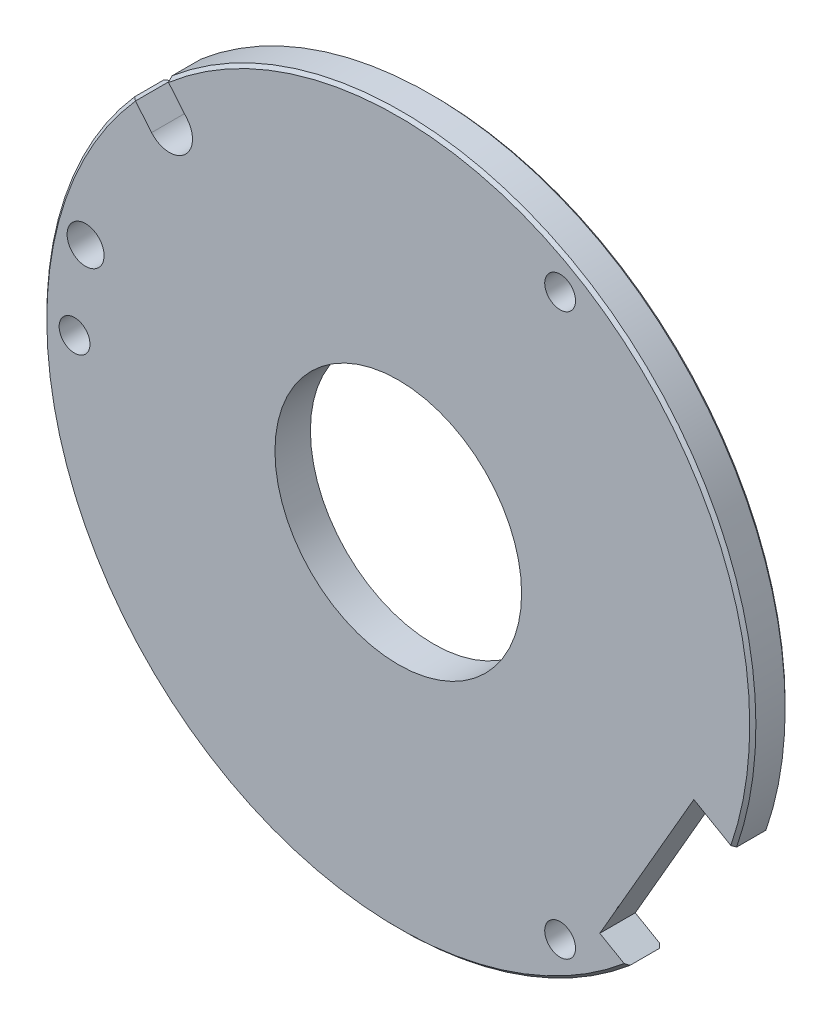
ISO-10303-21;
HEADER;
FILE_DESCRIPTION(('STEP AP214'),'2;1');
FILE_NAME('part.step','',(''),(''),'','','');
FILE_SCHEMA(('AUTOMOTIVE_DESIGN { 1 0 10303 214 1 1 1 1 }'));
ENDSEC;
DATA;
#1=APPLICATION_CONTEXT('core data for automotive mechanical design processes');
#2=APPLICATION_PROTOCOL_DEFINITION('international standard','automotive_design',2000,#1);
#3=PRODUCT_CONTEXT('',#1,'mechanical');
#4=PRODUCT('Part','Part','',(#3));
#5=PRODUCT_RELATED_PRODUCT_CATEGORY('part','',(#4));
#6=PRODUCT_DEFINITION_FORMATION('','',#4);
#7=PRODUCT_DEFINITION_CONTEXT('part definition',#1,'design');
#8=PRODUCT_DEFINITION('design','',#6,#7);
#9=PRODUCT_DEFINITION_SHAPE('','',#8);
#10=(LENGTH_UNIT() NAMED_UNIT(*) SI_UNIT(.MILLI.,.METRE.));
#11=(NAMED_UNIT(*) PLANE_ANGLE_UNIT() SI_UNIT($,.RADIAN.));
#12=(NAMED_UNIT(*) SI_UNIT($,.STERADIAN.) SOLID_ANGLE_UNIT());
#13=UNCERTAINTY_MEASURE_WITH_UNIT(LENGTH_MEASURE(1.E-05),#10,'distance_accuracy_value','');
#14=(GEOMETRIC_REPRESENTATION_CONTEXT(3) GLOBAL_UNCERTAINTY_ASSIGNED_CONTEXT((#13)) GLOBAL_UNIT_ASSIGNED_CONTEXT((#10,
#11,#12)) REPRESENTATION_CONTEXT('',''));
#15=CARTESIAN_POINT('',(0.,0.,0.));
#16=DIRECTION('',(0.,0.,1.));
#17=DIRECTION('',(1.,0.,0.));
#18=AXIS2_PLACEMENT_3D('',#15,#16,#17);
#19=CARTESIAN_POINT('',(0.,0.,10.4999999999999));
#20=DIRECTION('',(0.,0.,-1.));
#21=DIRECTION('',(-1.,0.,0.));
#22=AXIS2_PLACEMENT_3D('',#19,#20,#21);
#23=CONICAL_SURFACE('',#22,115.,0.785398163397457);
#24=CARTESIAN_POINT('',(-74.5095015168763,86.2806938427681,11.4998949724919));
#25=CARTESIAN_POINT('',(-74.489513181679,86.5174766303075,11.3337463305336));
#26=CARTESIAN_POINT('',(-74.4695396318063,86.7540842701747,11.1673474281076));
#27=CARTESIAN_POINT('',(-74.4296221029041,87.2269492522676,10.8340491039387));
#28=CARTESIAN_POINT('',(-74.4096781238743,87.4632065944968,10.6671496822008));
#29=CARTESIAN_POINT('',(-74.3897489301689,87.6992887890571,10.5));
#30=B_SPLINE_CURVE_WITH_KNOTS('',3,(#24,#25,#26,#27,#28,#29),.UNSPECIFIED.,.F.,.F.,(4,2,4),(0.,
0.869848500602146,1.73969699275379),.UNSPECIFIED.);
#31=CARTESIAN_POINT('',(-74.509444984043,86.2807076594142,11.4999214647664));
#32=VERTEX_POINT('',#31);
#33=CARTESIAN_POINT('',(-74.3897489301689,87.6992887890571,10.5));
#34=VERTEX_POINT('',#33);
#35=EDGE_CURVE('E134',#32,#34,#30,.T.);
#36=ORIENTED_EDGE('',*,*,#35,.F.);
#37=CARTESIAN_POINT('',(0.,0.,11.5));
#38=DIRECTION('',(0.,0.,-1.));
#39=DIRECTION('',(-1.,0.,0.));
#40=AXIS2_PLACEMENT_3D('',#37,#38,#39);
#41=CIRCLE('',#40,114.);
#42=CARTESIAN_POINT('',(107.871048306499,-36.8759669331806,11.4999999999999));
#43=VERTEX_POINT('',#42);
#44=EDGE_CURVE('E132',#32,#43,#41,.T.);
#45=ORIENTED_EDGE('',*,*,#44,.T.);
#46=CARTESIAN_POINT('',(107.871048306499,-36.8759669331806,11.4999999999999));
#47=CARTESIAN_POINT('',(108.018138427492,-36.9608894541314,11.3333475453197));
#48=CARTESIAN_POINT('',(108.16522250918,-37.0458084882875,11.1666879846456));
#49=CARTESIAN_POINT('',(108.459378593943,-37.215639583009,10.8333546513123));
#50=CARTESIAN_POINT('',(108.606450597018,-37.3005516435744,10.6666808786531));
#51=CARTESIAN_POINT('',(108.753516560787,-37.3854602173451,10.4999999999999));
#52=B_SPLINE_CURVE_WITH_KNOTS('',3,(#46,#47,#48,#49,#50,#51),.UNSPECIFIED.,.F.,.F.,(4,2,4),(0.,
0.713851110182392,1.42770222035386),.UNSPECIFIED.);
#53=CARTESIAN_POINT('',(108.753516560787,-37.3854602173452,10.5));
#54=VERTEX_POINT('',#53);
#55=EDGE_CURVE('E20',#43,#54,#52,.T.);
#56=ORIENTED_EDGE('',*,*,#55,.T.);
#57=CARTESIAN_POINT('',(0.,0.,10.5));
#58=DIRECTION('',(0.,0.,1.));
#59=DIRECTION('',(1.,0.,0.));
#60=AXIS2_PLACEMENT_3D('',#57,#58,#59);
#61=CIRCLE('',#60,115.);
#62=EDGE_CURVE('E160',#34,#54,#61,.F.);
#63=ORIENTED_EDGE('',*,*,#62,.F.);
#64=EDGE_LOOP('',(#36,#45,#56,#63));
#65=FACE_BOUND('',#64,.T.);
#66=ADVANCED_FACE('F16',(#65),#23,.T.);
#67=CARTESIAN_POINT('',(0.,0.,10.5));
#68=DIRECTION('',(0.,0.,-1.));
#69=DIRECTION('',(-1.,0.,0.));
#70=AXIS2_PLACEMENT_3D('',#67,#68,#69);
#71=CONICAL_SURFACE('',#70,115.,0.785398163397443);
#72=CARTESIAN_POINT('',(-86.5368112390781,75.7388955594955,10.5));
#73=CARTESIAN_POINT('',(-86.3200858516723,75.7357724950764,10.6651442506526));
#74=CARTESIAN_POINT('',(-86.1032347550848,75.7326476191581,10.8301229706168));
#75=CARTESIAN_POINT('',(-85.669281142456,75.7263942443073,11.1597493499963));
#76=CARTESIAN_POINT('',(-85.4521786264135,75.7232657453748,11.3243970094101));
#77=CARTESIAN_POINT('',(-85.234950401188,75.720135434943,11.4888791381337));
#78=B_SPLINE_CURVE_WITH_KNOTS('',3,(#72,#73,#74,#75,#76,#77),.UNSPECIFIED.,.F.,.F.,(4,2,4),(0.,
0.817477381237826,1.6349547665837),.UNSPECIFIED.);
#79=CARTESIAN_POINT('',(-86.5368112390781,75.7388955594955,10.5));
#80=VERTEX_POINT('',#79);
#81=CARTESIAN_POINT('',(-85.2349503365506,75.7201353165115,11.4888792651126));
#82=VERTEX_POINT('',#81);
#83=EDGE_CURVE('E232',#80,#82,#78,.T.);
#84=ORIENTED_EDGE('',*,*,#83,.F.);
#85=CARTESIAN_POINT('',(0.,0.,10.5));
#86=DIRECTION('',(0.,0.,1.));
#87=DIRECTION('',(1.,0.,0.));
#88=AXIS2_PLACEMENT_3D('',#85,#86,#87);
#89=CIRCLE('',#88,115.);
#90=CARTESIAN_POINT('',(74.1909814229737,-87.8675040927872,10.5));
#91=VERTEX_POINT('',#90);
#92=EDGE_CURVE('E165',#91,#80,#89,.F.);
#93=ORIENTED_EDGE('',*,*,#92,.F.);
#94=CARTESIAN_POINT('',(74.1909814229737,-87.8675040927872,10.5));
#95=CARTESIAN_POINT('',(74.0375052317576,-87.7788945724744,10.6667173681921));
#96=CARTESIAN_POINT('',(73.8840083989417,-87.6902731347284,10.833409385614));
#97=CARTESIAN_POINT('',(73.5769734500829,-87.5130064243542,11.1667427189473));
#98=CARTESIAN_POINT('',(73.4234353340401,-87.4243611517259,11.3333840348587));
#99=CARTESIAN_POINT('',(73.2698765763974,-87.3357039616645,11.5));
#100=B_SPLINE_CURVE_WITH_KNOTS('',3,(#94,#95,#96,#97,#98,#99),.UNSPECIFIED.,.F.,.F.,(4,2,4),(0.,
0.729939305876748,1.45987861188388),.UNSPECIFIED.);
#101=CARTESIAN_POINT('',(73.2698765763974,-87.3357039616645,11.5));
#102=VERTEX_POINT('',#101);
#103=EDGE_CURVE('E130',#91,#102,#100,.T.);
#104=ORIENTED_EDGE('',*,*,#103,.T.);
#105=CARTESIAN_POINT('',(0.,0.,11.5));
#106=DIRECTION('',(0.,0.,-1.));
#107=DIRECTION('',(-1.,0.,0.));
#108=AXIS2_PLACEMENT_3D('',#105,#106,#107);
#109=CIRCLE('',#108,114.);
#110=CARTESIAN_POINT('',(-85.227752159781,75.7114935910721,11.5));
#111=VERTEX_POINT('',#110);
#112=EDGE_CURVE('E212',#102,#111,#109,.T.);
#113=ORIENTED_EDGE('',*,*,#112,.T.);
#114=CARTESIAN_POINT('',(-85.227752159781,75.7114935910721,11.5));
#115=CARTESIAN_POINT('',(-85.2280520943159,75.7118536632038,11.4995366285518));
#116=CARTESIAN_POINT('',(-85.2283520282152,75.712213735906,11.4990732571354));
#117=CARTESIAN_POINT('',(-85.2289518947835,75.712933882501,11.4981465143027));
#118=CARTESIAN_POINT('',(-85.2292518274527,75.7132939563938,11.4976831428863));
#119=CARTESIAN_POINT('',(-85.2298516915608,75.7140141053701,11.4967564000536));
#120=CARTESIAN_POINT('',(-85.2301516229997,75.7143741804535,11.4962930286373));
#121=CARTESIAN_POINT('',(-85.2307514846475,75.7150943318109,11.4953662858046));
#122=CARTESIAN_POINT('',(-85.2310514148564,75.7154544080849,11.4949029143882));
#123=CARTESIAN_POINT('',(-85.2316512740439,75.7161745618235,11.4939761715555));
#124=CARTESIAN_POINT('',(-85.2319512030226,75.7165346392881,11.4935128001392));
#125=CARTESIAN_POINT('',(-85.2325510597499,75.7172547954079,11.4925860573064));
#126=CARTESIAN_POINT('',(-85.2328509874984,75.717614874063,11.4921226858901));
#127=CARTESIAN_POINT('',(-85.2334508417653,75.718335032564,11.4911959430574));
#128=CARTESIAN_POINT('',(-85.2337507682837,75.7186951124098,11.490732571641));
#129=CARTESIAN_POINT('',(-85.2343506200904,75.7194152732919,11.4898058288083));
#130=CARTESIAN_POINT('',(-85.2346505453786,75.7197753543282,11.489342457392));
#131=CARTESIAN_POINT('',(-85.2349504700312,75.7201354359351,11.4888790860075));
#132=B_SPLINE_CURVE_WITH_KNOTS('',3,(#114,#115,#116,#117,#118,#119,#120,#121,#122,#123,#124,
#125,#126,#127,#128,#129,#130,#131),.UNSPECIFIED.,.F.,.F.,(4,2,2,2,2,2,2,2,4),(0.,
0.00197710188876395,0.0039542040495206,0.00593130648223299,0.00790840918692815,
0.00988551216360177,0.0118626154122581,0.0138397189329045,0.0158168227255363),.UNSPECIFIED.);
#133=EDGE_CURVE('E238',#111,#82,#132,.T.);
#134=ORIENTED_EDGE('',*,*,#133,.T.);
#135=EDGE_LOOP('',(#84,#93,#104,#113,#134));
#136=FACE_BOUND('',#135,.T.);
#137=ADVANCED_FACE('F224',(#136),#71,.T.);
#138=CARTESIAN_POINT('',(-85.8858808545547,75.7295154977153,0.));
#139=DIRECTION('',(0.0144087420816191,0.999896188687418,0.));
#140=DIRECTION('',(-0.999896188687418,0.0144087420816191,0.));
#141=AXIS2_PLACEMENT_3D('',#138,#139,#140);
#142=PLANE('',#141);
#143=DIRECTION('',(0.,0.,1.));
#144=VECTOR('',#143,1.);
#145=CARTESIAN_POINT('',(-86.5368112390781,75.7388955594955,0.));
#146=LINE('',#145,#144);
#147=CARTESIAN_POINT('',(-86.5368112390781,75.7388955594955,1.00000000000001));
#148=VERTEX_POINT('',#147);
#149=EDGE_CURVE('E138',#80,#148,#146,.F.);
#150=ORIENTED_EDGE('',*,*,#149,.F.);
#151=ORIENTED_EDGE('',*,*,#83,.T.);
#152=DIRECTION('',(0.,0.,1.));
#153=VECTOR('',#152,1.);
#154=CARTESIAN_POINT('',(-85.2349504700312,75.7201354359351,11.5));
#155=LINE('',#154,#153);
#156=CARTESIAN_POINT('',(-85.2349504700312,75.7201354359351,0.0111209139925274));
#157=VERTEX_POINT('',#156);
#158=EDGE_CURVE('E210',#82,#157,#155,.F.);
#159=ORIENTED_EDGE('',*,*,#158,.T.);
#160=CARTESIAN_POINT('',(-86.5368112390781,75.7388955594955,1.00000000000001));
#161=CARTESIAN_POINT('',(-86.3200858631194,75.7357724952414,0.834855758070353));
#162=CARTESIAN_POINT('',(-86.1032347779924,75.7326476194882,0.669877046811544));
#163=CARTESIAN_POINT('',(-85.6692811883114,75.7263942449681,0.340250684807384));
#164=CARTESIAN_POINT('',(-85.4521786837561,75.7232657462011,0.175603034063697));
#165=CARTESIAN_POINT('',(-85.2349504700312,75.7201354359351,0.0111209139925171));
#166=B_SPLINE_CURVE_WITH_KNOTS('',3,(#160,#161,#162,#163,#164,#165),.UNSPECIFIED.,.F.,.F.,(4,2,
4),(0.,0.817477338059394,1.63495468022682),.UNSPECIFIED.);
#167=EDGE_CURVE('E202',#148,#157,#166,.T.);
#168=ORIENTED_EDGE('',*,*,#167,.F.);
#169=EDGE_LOOP('',(#150,#151,#159,#168));
#170=FACE_BOUND('',#169,.T.);
#171=ADVANCED_FACE('F218',(#170),#142,.T.);
#172=CARTESIAN_POINT('',(-74.4496220929543,86.9900284007763,0.));
#173=DIRECTION('',(-0.996455871860306,0.0841171530374039,0.));
#174=DIRECTION('',(-0.0841171530374039,-0.996455871860306,0.));
#175=AXIS2_PLACEMENT_3D('',#172,#173,#174);
#176=PLANE('',#175);
#177=DIRECTION('',(0.,0.,1.));
#178=VECTOR('',#177,1.);
#179=CARTESIAN_POINT('',(-74.3897489301689,87.6992887890571,0.));
#180=LINE('',#179,#178);
#181=CARTESIAN_POINT('',(-74.3897489301689,87.6992887890571,1.00000000000001));
#182=VERTEX_POINT('',#181);
#183=EDGE_CURVE('E162',#182,#34,#180,.T.);
#184=ORIENTED_EDGE('',*,*,#183,.F.);
#185=CARTESIAN_POINT('',(-74.5094952557398,86.2807680124956,0.000157070467237926));
#186=CARTESIAN_POINT('',(-74.5045156996057,86.339760721662,0.0415509788410319));
#187=CARTESIAN_POINT('',(-74.4995369258523,86.3987424367257,0.0829606494987733));
#188=CARTESIAN_POINT('',(-74.4895761888686,86.5167410563578,0.165851523437291));
#189=CARTESIAN_POINT('',(-74.4845942272199,86.5757579396785,0.207332757154994));
#190=CARTESIAN_POINT('',(-74.4746271837633,86.6938269272522,0.290366757135819));
#191=CARTESIAN_POINT('',(-74.4696421036046,86.7528790102842,0.331919553771896));
#192=CARTESIAN_POINT('',(-74.459668892923,86.8710184284435,0.415096679692004));
#193=CARTESIAN_POINT('',(-74.4546807641172,86.9301057423763,0.456721039285317));
#194=CARTESIAN_POINT('',(-74.4447015263985,87.0483156533127,0.540041291170814));
#195=CARTESIAN_POINT('',(-74.4397104192712,87.1074382291485,0.581737213708681));
#196=CARTESIAN_POINT('',(-74.4297252956358,87.2257186946547,0.665200591559601));
#197=CARTESIAN_POINT('',(-74.4247312809819,87.2848765631838,0.706968077054888));
#198=CARTESIAN_POINT('',(-74.4147404134846,87.4032276446555,0.790574580846247));
#199=CARTESIAN_POINT('',(-74.4097435625642,87.4624208364836,0.83241362926118));
#200=CARTESIAN_POINT('',(-74.3997470942069,87.580842594871,0.916163259094312));
#201=CARTESIAN_POINT('',(-74.3947474787622,87.6400711403426,0.958073870568296));
#202=CARTESIAN_POINT('',(-74.3897489301689,87.6992887890571,1.00000000000001));
#203=B_SPLINE_CURVE_WITH_KNOTS('',3,(#185,#186,#187,#188,#189,#190,#191,#192,#193,#194,#195,
#196,#197,#198,#199,#200,#201,#202),.UNSPECIFIED.,.F.,.F.,(4,2,2,2,2,2,2,2,4),(0.,
0.216715299702462,0.433640499860595,0.65077572405921,0.868121095036535,1.08567673468897,
1.30344276407608,1.52141930342553,1.73960647213781),.UNSPECIFIED.);
#204=CARTESIAN_POINT('',(-74.509444984043,86.2807076594142,7.85352336403063E-05));
#205=VERTEX_POINT('',#204);
#206=EDGE_CURVE('E158',#205,#182,#203,.T.);
#207=ORIENTED_EDGE('',*,*,#206,.F.);
#208=DIRECTION('',(0.,0.,1.));
#209=VECTOR('',#208,1.);
#210=CARTESIAN_POINT('',(-74.5094952557398,86.2807680124956,11.5));
#211=LINE('',#210,#209);
#212=EDGE_CURVE('E198',#205,#32,#211,.T.);
#213=ORIENTED_EDGE('',*,*,#212,.T.);
#214=ORIENTED_EDGE('',*,*,#35,.T.);
#215=EDGE_LOOP('',(#184,#207,#213,#214));
#216=FACE_BOUND('',#215,.T.);
#217=ADVANCED_FACE('F223',(#216),#176,.T.);
#218=CARTESIAN_POINT('',(0.,0.,0.));
#219=DIRECTION('',(0.,0.,1.));
#220=DIRECTION('',(1.,0.,0.));
#221=AXIS2_PLACEMENT_3D('',#218,#219,#220);
#222=CYLINDRICAL_SURFACE('',#221,115.);
#223=CARTESIAN_POINT('',(0.,0.,1.00000000000001));
#224=DIRECTION('',(0.,0.,1.));
#225=DIRECTION('',(1.,0.,0.));
#226=AXIS2_PLACEMENT_3D('',#223,#224,#225);
#227=CIRCLE('',#226,115.);
#228=CARTESIAN_POINT('',(108.753516560787,-37.3854602173451,1.00000000000014));
#229=VERTEX_POINT('',#228);
#230=EDGE_CURVE('E155',#182,#229,#227,.F.);
#231=ORIENTED_EDGE('',*,*,#230,.F.);
#232=ORIENTED_EDGE('',*,*,#183,.T.);
#233=ORIENTED_EDGE('',*,*,#62,.T.);
#234=DIRECTION('',(0.,0.,1.));
#235=VECTOR('',#234,1.);
#236=CARTESIAN_POINT('',(108.753516560787,-37.3854602173452,11.5));
#237=LINE('',#236,#235);
#238=EDGE_CURVE('E127',#54,#229,#237,.F.);
#239=ORIENTED_EDGE('',*,*,#238,.T.);
#240=EDGE_LOOP('',(#231,#232,#233,#239));
#241=FACE_BOUND('',#240,.T.);
#242=ADVANCED_FACE('F476',(#241),#222,.T.);
#243=CARTESIAN_POINT('',(74.2462120245875,-74.2462120245875,11.4999999999554));
#244=DIRECTION('',(0.,0.,1.));
#245=DIRECTION('',(1.,0.,0.));
#246=AXIS2_PLACEMENT_3D('',#243,#244,#245);
#247=CONICAL_SURFACE('',#246,3.50000000000346,0.71558499334998);
#248=CARTESIAN_POINT('',(74.2462120245875,-74.2462120245875,11.4999999999554));
#249=DIRECTION('',(0.,0.,1.));
#250=DIRECTION('',(1.,0.,0.));
#251=AXIS2_PLACEMENT_3D('',#248,#249,#250);
#252=CIRCLE('',#251,3.50000000000346);
#253=CARTESIAN_POINT('',(71.6493911432071,-71.8996142085897,11.4999999999546));
#254=VERTEX_POINT('',#253);
#255=CARTESIAN_POINT('',(70.9155882627301,-73.1705980803162,11.4999999999777));
#256=VERTEX_POINT('',#255);
#257=EDGE_CURVE('E137',#254,#256,#252,.T.);
#258=ORIENTED_EDGE('',*,*,#257,.T.);
#259=CARTESIAN_POINT('',(70.9155882627799,-73.17059808023,11.4999999999537));
#260=CARTESIAN_POINT('',(70.9596688988935,-73.0942481788513,11.4786788177842));
#261=CARTESIAN_POINT('',(71.0042035217947,-73.0171119492905,11.4609142861676));
#262=CARTESIAN_POINT('',(71.0938947817346,-72.8617621300798,11.4330504269131));
#263=CARTESIAN_POINT('',(71.139051805872,-72.7835478699551,11.4229561110493));
#264=CARTESIAN_POINT('',(71.2287110806137,-72.6282534507327,11.4111368137857));
#265=CARTESIAN_POINT('',(71.2732076738947,-72.5511830904063,11.4092438210896));
#266=CARTESIAN_POINT('',(71.3620761502339,-72.3972583741957,11.4134472165419));
#267=CARTESIAN_POINT('',(71.4064480985655,-72.3204039052545,11.4195380411825));
#268=CARTESIAN_POINT('',(71.4839261536543,-72.1862079773691,11.4369649959146));
#269=CARTESIAN_POINT('',(71.517128762641,-72.1286993716602,11.4466502651549));
#270=CARTESIAN_POINT('',(71.583433170094,-72.0138567691859,11.4702196142108));
#271=CARTESIAN_POINT('',(71.6165320646358,-71.956527802165,11.484136488115));
#272=CARTESIAN_POINT('',(71.6493911432053,-71.8996142085929,11.4999999999537));
#273=B_SPLINE_CURVE_WITH_KNOTS('',3,(#259,#260,#261,#262,#263,#264,#265,#266,#267,#268,#269,
#270,#271,#272),.UNSPECIFIED.,.F.,.F.,(4,2,2,2,2,2,4),(0.,0.27210659763537,0.544390839150599,
0.811069906412543,1.07756323763798,1.27876054549894,1.48155864924637),.UNSPECIFIED.);
#274=EDGE_CURVE('E144',#256,#254,#273,.T.);
#275=ORIENTED_EDGE('',*,*,#274,.T.);
#276=EDGE_LOOP('',(#258,#275));
#277=FACE_BOUND('',#276,.T.);
#278=ADVANCED_FACE('F468',(#277),#247,.F.);
#279=CARTESIAN_POINT('',(0.,0.,0.));
#280=DIRECTION('',(0.,0.,1.));
#281=DIRECTION('',(1.,0.,0.));
#282=AXIS2_PLACEMENT_3D('',#279,#280,#281);
#283=CYLINDRICAL_SURFACE('',#282,115.);
#284=CARTESIAN_POINT('',(0.,0.,1.00000000000001));
#285=DIRECTION('',(0.,0.,1.));
#286=DIRECTION('',(-1.,0.,0.));
#287=AXIS2_PLACEMENT_3D('',#284,#285,#286);
#288=CIRCLE('',#287,115.);
#289=CARTESIAN_POINT('',(74.1909814229737,-87.8675040927872,1.00000000000001));
#290=VERTEX_POINT('',#289);
#291=EDGE_CURVE('E211',#290,#148,#288,.F.);
#292=ORIENTED_EDGE('',*,*,#291,.F.);
#293=DIRECTION('',(0.,0.,1.));
#294=VECTOR('',#293,1.);
#295=CARTESIAN_POINT('',(74.1909814229737,-87.8675040927872,11.5));
#296=LINE('',#295,#294);
#297=EDGE_CURVE('E296',#290,#91,#296,.T.);
#298=ORIENTED_EDGE('',*,*,#297,.T.);
#299=ORIENTED_EDGE('',*,*,#92,.T.);
#300=ORIENTED_EDGE('',*,*,#149,.T.);
#301=EDGE_LOOP('',(#292,#298,#299,#300));
#302=FACE_BOUND('',#301,.T.);
#303=ADVANCED_FACE('F461',(#302),#283,.T.);
#304=CARTESIAN_POINT('',(0.,0.,11.5));
#305=DIRECTION('',(0.,0.,-1.));
#306=DIRECTION('',(-1.,0.,0.));
#307=AXIS2_PLACEMENT_3D('',#304,#305,#306);
#308=PLANE('',#307);
#309=CARTESIAN_POINT('',(0.,0.,11.5));
#310=DIRECTION('',(0.,0.,1.));
#311=DIRECTION('',(1.,0.,0.));
#312=AXIS2_PLACEMENT_3D('',#309,#310,#311);
#313=CIRCLE('',#312,40.);
#314=CARTESIAN_POINT('',(40.,0.,11.5));
#315=VERTEX_POINT('',#314);
#316=EDGE_CURVE('E297',#315,#315,#313,.F.);
#317=ORIENTED_EDGE('',*,*,#316,.T.);
#318=EDGE_LOOP('',(#317));
#319=FACE_BOUND('',#318,.T.);
#320=CARTESIAN_POINT('',(-105.,0.,11.5));
#321=DIRECTION('',(0.,0.,1.));
#322=DIRECTION('',(1.,0.,0.));
#323=AXIS2_PLACEMENT_3D('',#320,#321,#322);
#324=CIRCLE('',#323,5.);
#325=CARTESIAN_POINT('',(-100.,0.,11.5));
#326=VERTEX_POINT('',#325);
#327=EDGE_CURVE('E300',#326,#326,#324,.F.);
#328=ORIENTED_EDGE('',*,*,#327,.T.);
#329=EDGE_LOOP('',(#328));
#330=FACE_BOUND('',#329,.T.);
#331=CARTESIAN_POINT('',(52.5,90.932667397366,11.5));
#332=DIRECTION('',(0.,0.,1.));
#333=DIRECTION('',(1.,0.,0.));
#334=AXIS2_PLACEMENT_3D('',#331,#332,#333);
#335=CIRCLE('',#334,5.);
#336=CARTESIAN_POINT('',(57.5,90.932667397366,11.5));
#337=VERTEX_POINT('',#336);
#338=EDGE_CURVE('E303',#337,#337,#335,.F.);
#339=ORIENTED_EDGE('',*,*,#338,.T.);
#340=EDGE_LOOP('',(#339));
#341=FACE_BOUND('',#340,.T.);
#342=CARTESIAN_POINT('',(52.5,-90.9326673973661,11.5));
#343=DIRECTION('',(0.,0.,1.));
#344=DIRECTION('',(1.,0.,0.));
#345=AXIS2_PLACEMENT_3D('',#342,#343,#344);
#346=CIRCLE('',#345,5.);
#347=CARTESIAN_POINT('',(57.5,-90.9326673973661,11.5));
#348=VERTEX_POINT('',#347);
#349=EDGE_CURVE('E306',#348,#348,#346,.F.);
#350=ORIENTED_EDGE('',*,*,#349,.T.);
#351=EDGE_LOOP('',(#350));
#352=FACE_BOUND('',#351,.T.);
#353=CARTESIAN_POINT('',(-101.422211760352,27.1759997357648,11.5));
#354=DIRECTION('',(0.,0.,1.));
#355=DIRECTION('',(1.,0.,0.));
#356=AXIS2_PLACEMENT_3D('',#353,#354,#355);
#357=CIRCLE('',#356,6.);
#358=CARTESIAN_POINT('',(-95.422211760352,27.1759997357648,11.5));
#359=VERTEX_POINT('',#358);
#360=EDGE_CURVE('E309',#359,#359,#357,.F.);
#361=ORIENTED_EDGE('',*,*,#360,.T.);
#362=EDGE_LOOP('',(#361));
#363=FACE_BOUND('',#362,.T.);
#364=DIRECTION('',(0.866025403784439,-0.499999999999999,0.));
#365=VECTOR('',#364,1.);
#366=CARTESIAN_POINT('',(74.1909814229737,-87.8675040927872,11.5));
#367=LINE('',#366,#365);
#368=CARTESIAN_POINT('',(65.370489570875,-82.7749907475931,11.5));
#369=VERTEX_POINT('',#368);
#370=EDGE_CURVE('E362',#102,#369,#367,.F.);
#371=ORIENTED_EDGE('',*,*,#370,.T.);
#372=DIRECTION('',(-0.500000000000001,-0.866025403784438,0.));
#373=VECTOR('',#372,1.);
#374=CARTESIAN_POINT('',(84.870489570875,-49.,11.5));
#375=LINE('',#374,#373);
#376=EDGE_CURVE('E363',#369,#256,#375,.F.);
#377=ORIENTED_EDGE('',*,*,#376,.T.);
#378=ORIENTED_EDGE('',*,*,#257,.F.);
#379=DIRECTION('',(-0.500000000000001,-0.866025403784438,0.));
#380=VECTOR('',#379,1.);
#381=CARTESIAN_POINT('',(84.870489570875,-49.,11.5));
#382=LINE('',#381,#380);
#383=CARTESIAN_POINT('',(95.870489570875,-29.9474411167423,11.5));
#384=VERTEX_POINT('',#383);
#385=EDGE_CURVE('E143',#254,#384,#382,.F.);
#386=ORIENTED_EDGE('',*,*,#385,.T.);
#387=DIRECTION('',(-0.866025403784438,0.500000000000002,0.));
#388=VECTOR('',#387,1.);
#389=CARTESIAN_POINT('',(95.870489570875,-29.9474411167423,11.5));
#390=LINE('',#389,#388);
#391=EDGE_CURVE('E124',#384,#43,#390,.F.);
#392=ORIENTED_EDGE('',*,*,#391,.T.);
#393=ORIENTED_EDGE('',*,*,#44,.F.);
#394=DIRECTION('',(-0.640015048029206,0.768362374336597,0.));
#395=VECTOR('',#394,1.);
#396=CARTESIAN_POINT('',(-68.483494217063,79.0463248848066,11.5));
#397=LINE('',#396,#395);
#398=CARTESIAN_POINT('',(-68.483494217063,79.0463248848066,11.5));
#399=VERTEX_POINT('',#398);
#400=EDGE_CURVE('E387',#32,#399,#397,.F.);
#401=ORIENTED_EDGE('',*,*,#400,.T.);
#402=CARTESIAN_POINT('',(-74.2462120245875,74.2462120245875,11.5));
#403=DIRECTION('',(0.,0.,1.));
#404=DIRECTION('',(1.,0.,0.));
#405=AXIS2_PLACEMENT_3D('',#402,#403,#404);
#406=CIRCLE('',#405,7.5);
#407=CARTESIAN_POINT('',(-80.0089298321119,69.4460991643685,11.5));
#408=VERTEX_POINT('',#407);
#409=EDGE_CURVE('E199',#399,#408,#406,.F.);
#410=ORIENTED_EDGE('',*,*,#409,.T.);
#411=DIRECTION('',(0.640015048029208,-0.768362374336596,0.));
#412=VECTOR('',#411,1.);
#413=CARTESIAN_POINT('',(-85.8749655180604,76.4884978102717,11.5));
#414=LINE('',#413,#412);
#415=EDGE_CURVE('E170',#408,#111,#414,.F.);
#416=ORIENTED_EDGE('',*,*,#415,.T.);
#417=ORIENTED_EDGE('',*,*,#112,.F.);
#418=EDGE_LOOP('',(#371,#377,#378,#386,#392,#393,#401,#410,#416,#417));
#419=FACE_BOUND('',#418,.T.);
#420=ADVANCED_FACE('F140',(#319,#330,#341,#352,#363,#419),#308,.F.);
#421=CARTESIAN_POINT('',(0.,0.,1.00000000000002));
#422=DIRECTION('',(0.,0.,1.));
#423=DIRECTION('',(1.,0.,0.));
#424=AXIS2_PLACEMENT_3D('',#421,#422,#423);
#425=CONICAL_SURFACE('',#424,115.,0.785398163397446);
#426=DIRECTION('',(0.455104692971803,-0.546370469789746,-0.703106697576387));
#427=VECTOR('',#426,1.);
#428=CARTESIAN_POINT('',(-85.2349504700312,75.7201354359351,0.0111209139925343));
#429=LINE('',#428,#427);
#430=CARTESIAN_POINT('',(-85.227752159781,75.7114935910721,0.));
#431=VERTEX_POINT('',#430);
#432=EDGE_CURVE('E348',#157,#431,#429,.T.);
#433=ORIENTED_EDGE('',*,*,#432,.T.);
#434=CARTESIAN_POINT('',(0.,0.,0.));
#435=DIRECTION('',(0.,0.,1.));
#436=DIRECTION('',(1.,0.,0.));
#437=AXIS2_PLACEMENT_3D('',#434,#435,#436);
#438=CIRCLE('',#437,114.);
#439=CARTESIAN_POINT('',(73.2698765763974,-87.3357039616644,0.));
#440=VERTEX_POINT('',#439);
#441=EDGE_CURVE('E312',#440,#431,#438,.F.);
#442=ORIENTED_EDGE('',*,*,#441,.F.);
#443=CARTESIAN_POINT('',(73.2698765763974,-87.3357039616645,0.));
#444=CARTESIAN_POINT('',(73.4234353340401,-87.4243611517259,0.166615965141245));
#445=CARTESIAN_POINT('',(73.5769734500829,-87.5130064243542,0.333257281052647));
#446=CARTESIAN_POINT('',(73.8840083989417,-87.6902731347284,0.666590614385994));
#447=CARTESIAN_POINT('',(74.0375052317576,-87.7788945724744,0.833282631807931));
#448=CARTESIAN_POINT('',(74.1909814229737,-87.8675040927872,1.00000000000001));
#449=B_SPLINE_CURVE_WITH_KNOTS('',3,(#443,#444,#445,#446,#447,#448),.UNSPECIFIED.,.F.,.F.,(4,2,
4),(0.,0.729939306007133,1.45987861188389),.UNSPECIFIED.);
#450=EDGE_CURVE('E290',#440,#290,#449,.T.);
#451=ORIENTED_EDGE('',*,*,#450,.T.);
#452=ORIENTED_EDGE('',*,*,#291,.T.);
#453=ORIENTED_EDGE('',*,*,#167,.T.);
#454=EDGE_LOOP('',(#433,#442,#451,#452,#453));
#455=FACE_BOUND('',#454,.T.);
#456=ADVANCED_FACE('F214',(#455),#425,.T.);
#457=CARTESIAN_POINT('',(-85.8749655180604,76.4884978102717,11.5));
#458=DIRECTION('',(-0.768362374336596,-0.640015048029208,0.));
#459=DIRECTION('',(0.640015048029208,-0.768362374336596,0.));
#460=AXIS2_PLACEMENT_3D('',#457,#458,#459);
#461=PLANE('',#460);
#462=ORIENTED_EDGE('',*,*,#415,.F.);
#463=DIRECTION('',(0.,0.,1.));
#464=VECTOR('',#463,1.);
#465=CARTESIAN_POINT('',(-80.008929832112,69.4460991643684,11.5));
#466=LINE('',#465,#464);
#467=CARTESIAN_POINT('',(-80.0089298321119,69.4460991643685,0.));
#468=VERTEX_POINT('',#467);
#469=EDGE_CURVE('E201',#408,#468,#466,.F.);
#470=ORIENTED_EDGE('',*,*,#469,.T.);
#471=DIRECTION('',(0.640015048029212,-0.768362374336592,0.));
#472=VECTOR('',#471,1.);
#473=CARTESIAN_POINT('',(-85.227752159781,75.7114935910721,0.));
#474=LINE('',#473,#472);
#475=EDGE_CURVE('E315',#431,#468,#474,.T.);
#476=ORIENTED_EDGE('',*,*,#475,.F.);
#477=ORIENTED_EDGE('',*,*,#432,.F.);
#478=ORIENTED_EDGE('',*,*,#158,.F.);
#479=ORIENTED_EDGE('',*,*,#133,.F.);
#480=EDGE_LOOP('',(#462,#470,#476,#477,#478,#479));
#481=FACE_BOUND('',#480,.T.);
#482=ADVANCED_FACE('F445',(#481),#461,.F.);
#483=CARTESIAN_POINT('',(-74.2462120245875,74.2462120245875,11.5));
#484=DIRECTION('',(0.,0.,1.));
#485=DIRECTION('',(1.,0.,0.));
#486=AXIS2_PLACEMENT_3D('',#483,#484,#485);
#487=CYLINDRICAL_SURFACE('',#486,7.5);
#488=CARTESIAN_POINT('',(-74.2462120245875,74.2462120245875,0.));
#489=DIRECTION('',(0.,0.,1.));
#490=DIRECTION('',(1.,0.,0.));
#491=AXIS2_PLACEMENT_3D('',#488,#489,#490);
#492=CIRCLE('',#491,7.5);
#493=CARTESIAN_POINT('',(-68.483494217063,79.0463248848066,0.));
#494=VERTEX_POINT('',#493);
#495=EDGE_CURVE('E316',#468,#494,#492,.T.);
#496=ORIENTED_EDGE('',*,*,#495,.F.);
#497=ORIENTED_EDGE('',*,*,#469,.F.);
#498=ORIENTED_EDGE('',*,*,#409,.F.);
#499=DIRECTION('',(0.,0.,1.));
#500=VECTOR('',#499,1.);
#501=CARTESIAN_POINT('',(-68.483494217063,79.0463248848066,11.5));
#502=LINE('',#501,#500);
#503=EDGE_CURVE('E384',#399,#494,#502,.F.);
#504=ORIENTED_EDGE('',*,*,#503,.T.);
#505=EDGE_LOOP('',(#496,#497,#498,#504));
#506=FACE_BOUND('',#505,.T.);
#507=ADVANCED_FACE('F395',(#506),#487,.F.);
#508=CARTESIAN_POINT('',(-68.483494217063,79.0463248848066,11.5));
#509=DIRECTION('',(0.768362374336597,0.640015048029206,0.));
#510=DIRECTION('',(-0.640015048029206,0.768362374336597,0.));
#511=AXIS2_PLACEMENT_3D('',#508,#509,#510);
#512=PLANE('',#511);
#513=DIRECTION('',(-0.640015048029207,0.768362374336596,0.));
#514=VECTOR('',#513,1.);
#515=CARTESIAN_POINT('',(-68.483494217063,79.0463248848066,0.));
#516=LINE('',#515,#514);
#517=EDGE_CURVE('E319',#494,#205,#516,.T.);
#518=ORIENTED_EDGE('',*,*,#517,.F.);
#519=ORIENTED_EDGE('',*,*,#503,.F.);
#520=ORIENTED_EDGE('',*,*,#400,.F.);
#521=ORIENTED_EDGE('',*,*,#212,.F.);
#522=EDGE_LOOP('',(#518,#519,#520,#521));
#523=FACE_BOUND('',#522,.T.);
#524=ADVANCED_FACE('F182',(#523),#512,.F.);
#525=CARTESIAN_POINT('',(0.,0.,1.00000000000014));
#526=DIRECTION('',(0.,0.,1.));
#527=DIRECTION('',(1.,0.,0.));
#528=AXIS2_PLACEMENT_3D('',#525,#526,#527);
#529=CONICAL_SURFACE('',#528,115.,0.785398163397454);
#530=ORIENTED_EDGE('',*,*,#206,.T.);
#531=ORIENTED_EDGE('',*,*,#230,.T.);
#532=CARTESIAN_POINT('',(108.753516560787,-37.3854602173451,1.00000000000011));
#533=CARTESIAN_POINT('',(108.606450597018,-37.3005516435744,0.833319121346967));
#534=CARTESIAN_POINT('',(108.459378593943,-37.215639583009,0.6666453486877));
#535=CARTESIAN_POINT('',(108.16522250918,-37.0458084882875,0.333312015354379));
#536=CARTESIAN_POINT('',(108.018138427492,-36.9608894541314,0.166652454680324));
#537=CARTESIAN_POINT('',(107.871048306499,-36.8759669331807,1.4802964454326E-13));
#538=B_SPLINE_CURVE_WITH_KNOTS('',3,(#532,#533,#534,#535,#536,#537),.UNSPECIFIED.,.F.,.F.,(4,2,
4),(0.,0.713851110171466,1.42770222035384),.UNSPECIFIED.);
#539=CARTESIAN_POINT('',(107.871048306499,-36.8759669331806,1.53601796080741E-13));
#540=VERTEX_POINT('',#539);
#541=EDGE_CURVE('E145',#229,#540,#538,.T.);
#542=ORIENTED_EDGE('',*,*,#541,.T.);
#543=CARTESIAN_POINT('',(0.,0.,1.60678761962352E-13));
#544=DIRECTION('',(0.,0.,1.));
#545=DIRECTION('',(1.,0.,0.));
#546=AXIS2_PLACEMENT_3D('',#543,#544,#545);
#547=CIRCLE('',#546,114.);
#548=EDGE_CURVE('E322',#205,#540,#547,.F.);
#549=ORIENTED_EDGE('',*,*,#548,.F.);
#550=EDGE_LOOP('',(#530,#531,#542,#549));
#551=FACE_BOUND('',#550,.T.);
#552=ADVANCED_FACE('F173',(#551),#529,.T.);
#553=CARTESIAN_POINT('',(95.870489570875,-29.9474411167423,11.5));
#554=DIRECTION('',(0.500000000000002,0.866025403784438,0.));
#555=DIRECTION('',(-0.866025403784438,0.500000000000002,0.));
#556=AXIS2_PLACEMENT_3D('',#553,#554,#555);
#557=PLANE('',#556);
#558=ORIENTED_EDGE('',*,*,#391,.F.);
#559=DIRECTION('',(0.,0.,1.));
#560=VECTOR('',#559,1.);
#561=CARTESIAN_POINT('',(95.8704895708751,-29.9474411167423,11.5));
#562=LINE('',#561,#560);
#563=CARTESIAN_POINT('',(95.870489570875,-29.9474411167423,0.));
#564=VERTEX_POINT('',#563);
#565=EDGE_CURVE('E368',#384,#564,#562,.F.);
#566=ORIENTED_EDGE('',*,*,#565,.T.);
#567=DIRECTION('',(-0.866025403784443,0.499999999999993,0.));
#568=VECTOR('',#567,1.);
#569=CARTESIAN_POINT('',(107.871048306499,-36.8759669331806,0.));
#570=LINE('',#569,#568);
#571=EDGE_CURVE('E325',#540,#564,#570,.T.);
#572=ORIENTED_EDGE('',*,*,#571,.F.);
#573=ORIENTED_EDGE('',*,*,#541,.F.);
#574=ORIENTED_EDGE('',*,*,#238,.F.);
#575=ORIENTED_EDGE('',*,*,#55,.F.);
#576=EDGE_LOOP('',(#558,#566,#572,#573,#574,#575));
#577=FACE_BOUND('',#576,.T.);
#578=ADVANCED_FACE('F122',(#577),#557,.F.);
#579=CARTESIAN_POINT('',(84.870489570875,-49.,11.5));
#580=DIRECTION('',(-0.866025403784438,0.500000000000001,0.));
#581=DIRECTION('',(-0.500000000000001,-0.866025403784438,0.));
#582=AXIS2_PLACEMENT_3D('',#579,#580,#581);
#583=PLANE('',#582);
#584=DIRECTION('',(0.,0.,1.));
#585=VECTOR('',#584,1.);
#586=CARTESIAN_POINT('',(65.370489570875,-82.7749907475931,11.5));
#587=LINE('',#586,#585);
#588=CARTESIAN_POINT('',(65.370489570875,-82.7749907475931,0.));
#589=VERTEX_POINT('',#588);
#590=EDGE_CURVE('E39',#369,#589,#587,.F.);
#591=ORIENTED_EDGE('',*,*,#590,.T.);
#592=DIRECTION('',(-0.5,-0.866025403784439,0.));
#593=VECTOR('',#592,1.);
#594=CARTESIAN_POINT('',(95.870489570875,-29.9474411167423,0.));
#595=LINE('',#594,#593);
#596=EDGE_CURVE('E413',#564,#589,#595,.T.);
#597=ORIENTED_EDGE('',*,*,#596,.F.);
#598=ORIENTED_EDGE('',*,*,#565,.F.);
#599=ORIENTED_EDGE('',*,*,#385,.F.);
#600=ORIENTED_EDGE('',*,*,#274,.F.);
#601=ORIENTED_EDGE('',*,*,#376,.F.);
#602=EDGE_LOOP('',(#591,#597,#598,#599,#600,#601));
#603=FACE_BOUND('',#602,.T.);
#604=ADVANCED_FACE('F286',(#603),#583,.F.);
#605=CARTESIAN_POINT('',(74.1909814229737,-87.8675040927872,11.5));
#606=DIRECTION('',(-0.499999999999999,-0.866025403784439,0.));
#607=DIRECTION('',(0.866025403784439,-0.499999999999999,0.));
#608=AXIS2_PLACEMENT_3D('',#605,#606,#607);
#609=PLANE('',#608);
#610=ORIENTED_EDGE('',*,*,#297,.F.);
#611=ORIENTED_EDGE('',*,*,#450,.F.);
#612=DIRECTION('',(0.866025403784443,-0.499999999999993,0.));
#613=VECTOR('',#612,1.);
#614=CARTESIAN_POINT('',(65.370489570875,-82.7749907475931,0.));
#615=LINE('',#614,#613);
#616=EDGE_CURVE('E330',#589,#440,#615,.T.);
#617=ORIENTED_EDGE('',*,*,#616,.F.);
#618=ORIENTED_EDGE('',*,*,#590,.F.);
#619=ORIENTED_EDGE('',*,*,#370,.F.);
#620=ORIENTED_EDGE('',*,*,#103,.F.);
#621=EDGE_LOOP('',(#610,#611,#617,#618,#619,#620));
#622=FACE_BOUND('',#621,.T.);
#623=ADVANCED_FACE('F282',(#622),#609,.F.);
#624=CARTESIAN_POINT('',(0.,0.,0.));
#625=DIRECTION('',(0.,0.,1.));
#626=DIRECTION('',(1.,0.,0.));
#627=AXIS2_PLACEMENT_3D('',#624,#625,#626);
#628=CYLINDRICAL_SURFACE('',#627,40.);
#629=CARTESIAN_POINT('',(0.,0.,0.));
#630=DIRECTION('',(0.,0.,1.));
#631=DIRECTION('',(1.,0.,0.));
#632=AXIS2_PLACEMENT_3D('',#629,#630,#631);
#633=CIRCLE('',#632,40.);
#634=CARTESIAN_POINT('',(40.,0.,0.));
#635=VERTEX_POINT('',#634);
#636=EDGE_CURVE('E326',#635,#635,#633,.T.);
#637=ORIENTED_EDGE('',*,*,#636,.F.);
#638=EDGE_LOOP('',(#637));
#639=FACE_BOUND('',#638,.T.);
#640=ORIENTED_EDGE('',*,*,#316,.F.);
#641=EDGE_LOOP('',(#640));
#642=FACE_BOUND('',#641,.T.);
#643=ADVANCED_FACE('F279',(#639,#642),#628,.F.);
#644=CARTESIAN_POINT('',(-105.,0.,11.5));
#645=DIRECTION('',(0.,0.,1.));
#646=DIRECTION('',(1.,0.,0.));
#647=AXIS2_PLACEMENT_3D('',#644,#645,#646);
#648=CYLINDRICAL_SURFACE('',#647,5.);
#649=CARTESIAN_POINT('',(-105.,0.,0.));
#650=DIRECTION('',(0.,0.,1.));
#651=DIRECTION('',(1.,0.,0.));
#652=AXIS2_PLACEMENT_3D('',#649,#650,#651);
#653=CIRCLE('',#652,5.);
#654=CARTESIAN_POINT('',(-100.,0.,0.));
#655=VERTEX_POINT('',#654);
#656=EDGE_CURVE('E329',#655,#655,#653,.T.);
#657=ORIENTED_EDGE('',*,*,#656,.F.);
#658=EDGE_LOOP('',(#657));
#659=FACE_BOUND('',#658,.T.);
#660=ORIENTED_EDGE('',*,*,#327,.F.);
#661=EDGE_LOOP('',(#660));
#662=FACE_BOUND('',#661,.T.);
#663=ADVANCED_FACE('F275',(#659,#662),#648,.F.);
#664=CARTESIAN_POINT('',(52.5,90.932667397366,11.5));
#665=DIRECTION('',(0.,0.,1.));
#666=DIRECTION('',(1.,0.,0.));
#667=AXIS2_PLACEMENT_3D('',#664,#665,#666);
#668=CYLINDRICAL_SURFACE('',#667,5.);
#669=CARTESIAN_POINT('',(52.5,90.932667397366,0.));
#670=DIRECTION('',(0.,0.,1.));
#671=DIRECTION('',(1.,0.,0.));
#672=AXIS2_PLACEMENT_3D('',#669,#670,#671);
#673=CIRCLE('',#672,5.);
#674=CARTESIAN_POINT('',(57.5,90.932667397366,0.));
#675=VERTEX_POINT('',#674);
#676=EDGE_CURVE('E333',#675,#675,#673,.T.);
#677=ORIENTED_EDGE('',*,*,#676,.F.);
#678=EDGE_LOOP('',(#677));
#679=FACE_BOUND('',#678,.T.);
#680=ORIENTED_EDGE('',*,*,#338,.F.);
#681=EDGE_LOOP('',(#680));
#682=FACE_BOUND('',#681,.T.);
#683=ADVANCED_FACE('F271',(#679,#682),#668,.F.);
#684=CARTESIAN_POINT('',(52.5,-90.9326673973661,11.5));
#685=DIRECTION('',(0.,0.,1.));
#686=DIRECTION('',(1.,0.,0.));
#687=AXIS2_PLACEMENT_3D('',#684,#685,#686);
#688=CYLINDRICAL_SURFACE('',#687,5.);
#689=CARTESIAN_POINT('',(52.5,-90.9326673973661,0.));
#690=DIRECTION('',(0.,0.,1.));
#691=DIRECTION('',(1.,0.,0.));
#692=AXIS2_PLACEMENT_3D('',#689,#690,#691);
#693=CIRCLE('',#692,5.);
#694=CARTESIAN_POINT('',(57.5,-90.9326673973661,0.));
#695=VERTEX_POINT('',#694);
#696=EDGE_CURVE('E30',#695,#695,#693,.T.);
#697=ORIENTED_EDGE('',*,*,#696,.F.);
#698=EDGE_LOOP('',(#697));
#699=FACE_BOUND('',#698,.T.);
#700=ORIENTED_EDGE('',*,*,#349,.F.);
#701=EDGE_LOOP('',(#700));
#702=FACE_BOUND('',#701,.T.);
#703=ADVANCED_FACE('F264',(#699,#702),#688,.F.);
#704=CARTESIAN_POINT('',(-101.422211760352,27.1759997357648,11.5));
#705=DIRECTION('',(0.,0.,1.));
#706=DIRECTION('',(1.,0.,0.));
#707=AXIS2_PLACEMENT_3D('',#704,#705,#706);
#708=CYLINDRICAL_SURFACE('',#707,6.);
#709=CARTESIAN_POINT('',(-101.422211760352,27.1759997357648,0.));
#710=DIRECTION('',(0.,0.,1.));
#711=DIRECTION('',(1.,0.,0.));
#712=AXIS2_PLACEMENT_3D('',#709,#710,#711);
#713=CIRCLE('',#712,6.);
#714=CARTESIAN_POINT('',(-95.422211760352,27.1759997357648,0.));
#715=VERTEX_POINT('',#714);
#716=EDGE_CURVE('E11',#715,#715,#713,.T.);
#717=ORIENTED_EDGE('',*,*,#716,.F.);
#718=EDGE_LOOP('',(#717));
#719=FACE_BOUND('',#718,.T.);
#720=ORIENTED_EDGE('',*,*,#360,.F.);
#721=EDGE_LOOP('',(#720));
#722=FACE_BOUND('',#721,.T.);
#723=ADVANCED_FACE('F258',(#719,#722),#708,.F.);
#724=CARTESIAN_POINT('',(0.,0.,0.));
#725=DIRECTION('',(0.,0.,-1.));
#726=DIRECTION('',(-1.,0.,0.));
#727=AXIS2_PLACEMENT_3D('',#724,#725,#726);
#728=PLANE('',#727);
#729=ORIENTED_EDGE('',*,*,#716,.T.);
#730=EDGE_LOOP('',(#729));
#731=FACE_BOUND('',#730,.T.);
#732=ORIENTED_EDGE('',*,*,#696,.T.);
#733=EDGE_LOOP('',(#732));
#734=FACE_BOUND('',#733,.T.);
#735=ORIENTED_EDGE('',*,*,#676,.T.);
#736=EDGE_LOOP('',(#735));
#737=FACE_BOUND('',#736,.T.);
#738=ORIENTED_EDGE('',*,*,#656,.T.);
#739=EDGE_LOOP('',(#738));
#740=FACE_BOUND('',#739,.T.);
#741=ORIENTED_EDGE('',*,*,#636,.T.);
#742=EDGE_LOOP('',(#741));
#743=FACE_BOUND('',#742,.T.);
#744=ORIENTED_EDGE('',*,*,#596,.T.);
#745=ORIENTED_EDGE('',*,*,#616,.T.);
#746=ORIENTED_EDGE('',*,*,#441,.T.);
#747=ORIENTED_EDGE('',*,*,#475,.T.);
#748=ORIENTED_EDGE('',*,*,#495,.T.);
#749=ORIENTED_EDGE('',*,*,#517,.T.);
#750=ORIENTED_EDGE('',*,*,#548,.T.);
#751=ORIENTED_EDGE('',*,*,#571,.T.);
#752=EDGE_LOOP('',(#744,#745,#746,#747,#748,#749,#750,#751));
#753=FACE_BOUND('',#752,.T.);
#754=ADVANCED_FACE('F256',(#731,#734,#737,#740,#743,#753),#728,.T.);
#755=CLOSED_SHELL('',(#66,#137,#171,#217,#242,#278,#303,#420,#456,#482,#507,#524,#552,#578,#604,
#623,#643,#663,#683,#703,#723,#754));
#756=MANIFOLD_SOLID_BREP('B1',#755);
#757=ADVANCED_BREP_SHAPE_REPRESENTATION('',(#18,#756),#14);
#758=SHAPE_DEFINITION_REPRESENTATION(#9,#757);
ENDSEC;
END-ISO-10303-21;
